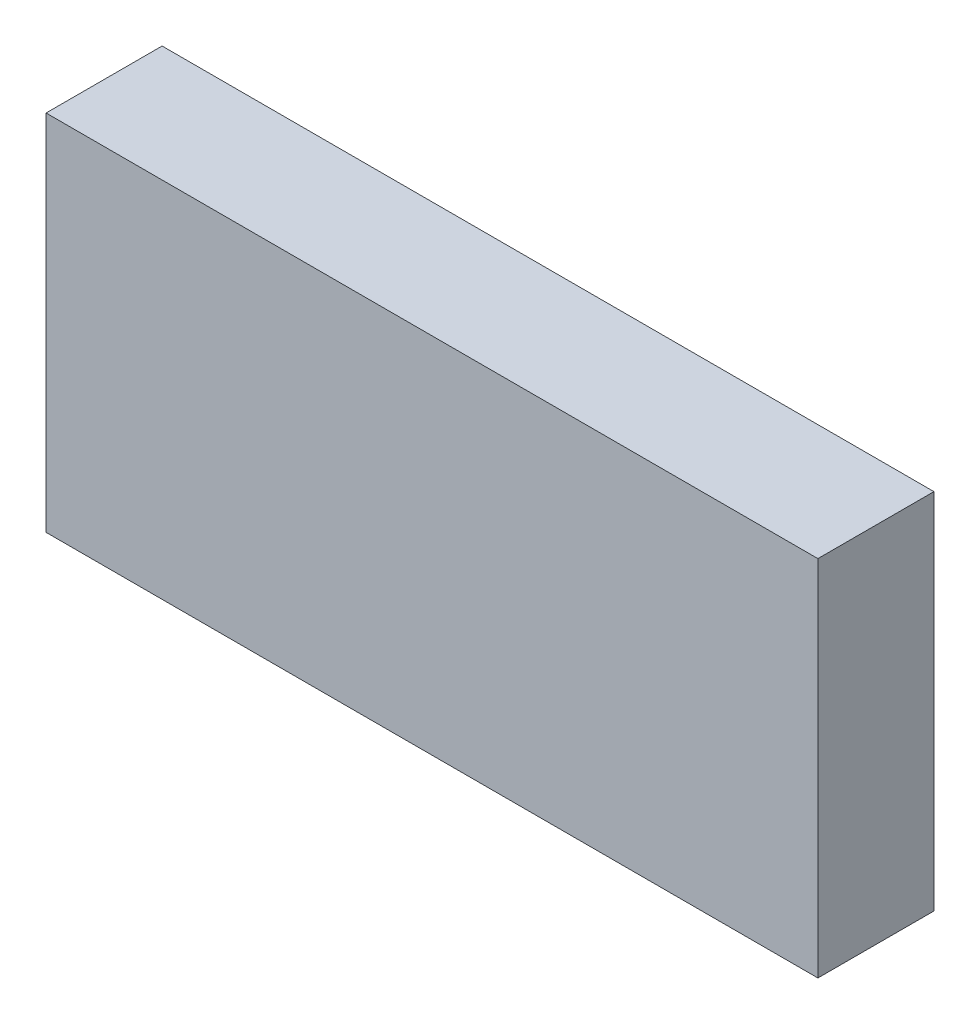
ISO-10303-21;
HEADER;
FILE_DESCRIPTION(('STEP AP214'),'2;1');
FILE_NAME('part.step','',(''),(''),'','','');
FILE_SCHEMA(('AUTOMOTIVE_DESIGN { 1 0 10303 214 1 1 1 1 }'));
ENDSEC;
DATA;
#1=APPLICATION_CONTEXT('core data for automotive mechanical design processes');
#2=APPLICATION_PROTOCOL_DEFINITION('international standard','automotive_design',2000,#1);
#3=PRODUCT_CONTEXT('',#1,'mechanical');
#4=PRODUCT('Part','Part','',(#3));
#5=PRODUCT_RELATED_PRODUCT_CATEGORY('part','',(#4));
#6=PRODUCT_DEFINITION_FORMATION('','',#4);
#7=PRODUCT_DEFINITION_CONTEXT('part definition',#1,'design');
#8=PRODUCT_DEFINITION('design','',#6,#7);
#9=PRODUCT_DEFINITION_SHAPE('','',#8);
#10=(LENGTH_UNIT() NAMED_UNIT(*) SI_UNIT(.MILLI.,.METRE.));
#11=(NAMED_UNIT(*) PLANE_ANGLE_UNIT() SI_UNIT($,.RADIAN.));
#12=(NAMED_UNIT(*) SI_UNIT($,.STERADIAN.) SOLID_ANGLE_UNIT());
#13=UNCERTAINTY_MEASURE_WITH_UNIT(LENGTH_MEASURE(1.E-05),#10,'distance_accuracy_value','');
#14=(GEOMETRIC_REPRESENTATION_CONTEXT(3) GLOBAL_UNCERTAINTY_ASSIGNED_CONTEXT((#13)) GLOBAL_UNIT_ASSIGNED_CONTEXT((#10,
#11,#12)) REPRESENTATION_CONTEXT('',''));
#15=CARTESIAN_POINT('',(0.,0.,0.));
#16=DIRECTION('',(0.,0.,1.));
#17=DIRECTION('',(1.,0.,0.));
#18=AXIS2_PLACEMENT_3D('',#15,#16,#17);
#19=CARTESIAN_POINT('',(-76.5,-36.,0.));
#20=DIRECTION('',(0.,0.,1.));
#21=DIRECTION('',(1.,0.,0.));
#22=AXIS2_PLACEMENT_3D('',#19,#20,#21);
#23=PLANE('',#22);
#24=DIRECTION('',(0.,1.,0.));
#25=VECTOR('',#24,1.);
#26=CARTESIAN_POINT('',(-76.5,-36.,0.));
#27=LINE('',#26,#25);
#28=CARTESIAN_POINT('',(-76.5,-36.,0.));
#29=VERTEX_POINT('',#28);
#30=CARTESIAN_POINT('',(-76.5,36.,0.));
#31=VERTEX_POINT('',#30);
#32=EDGE_CURVE('E78',#29,#31,#27,.T.);
#33=ORIENTED_EDGE('',*,*,#32,.F.);
#34=DIRECTION('',(1.,0.,0.));
#35=VECTOR('',#34,1.);
#36=CARTESIAN_POINT('',(-76.5,-36.,0.));
#37=LINE('',#36,#35);
#38=CARTESIAN_POINT('',(76.5,-36.,0.));
#39=VERTEX_POINT('',#38);
#40=EDGE_CURVE('E61',#29,#39,#37,.T.);
#41=ORIENTED_EDGE('',*,*,#40,.T.);
#42=DIRECTION('',(0.,1.,0.));
#43=VECTOR('',#42,1.);
#44=CARTESIAN_POINT('',(76.5,-36.,0.));
#45=LINE('',#44,#43);
#46=CARTESIAN_POINT('',(76.5,36.,0.));
#47=VERTEX_POINT('',#46);
#48=EDGE_CURVE('E72',#39,#47,#45,.T.);
#49=ORIENTED_EDGE('',*,*,#48,.T.);
#50=DIRECTION('',(1.,0.,0.));
#51=VECTOR('',#50,1.);
#52=CARTESIAN_POINT('',(-76.5,36.,0.));
#53=LINE('',#52,#51);
#54=EDGE_CURVE('E9',#31,#47,#53,.T.);
#55=ORIENTED_EDGE('',*,*,#54,.F.);
#56=EDGE_LOOP('',(#33,#41,#49,#55));
#57=FACE_BOUND('',#56,.T.);
#58=ADVANCED_FACE('F14',(#57),#23,.T.);
#59=CARTESIAN_POINT('',(-76.5,-36.,-23.));
#60=DIRECTION('',(0.,0.,1.));
#61=DIRECTION('',(1.,0.,0.));
#62=AXIS2_PLACEMENT_3D('',#59,#60,#61);
#63=PLANE('',#62);
#64=DIRECTION('',(1.,0.,0.));
#65=VECTOR('',#64,1.);
#66=CARTESIAN_POINT('',(-76.5,36.,-23.));
#67=LINE('',#66,#65);
#68=CARTESIAN_POINT('',(-76.5,36.,-23.));
#69=VERTEX_POINT('',#68);
#70=CARTESIAN_POINT('',(76.5,36.,-23.));
#71=VERTEX_POINT('',#70);
#72=EDGE_CURVE('E25',#69,#71,#67,.T.);
#73=ORIENTED_EDGE('',*,*,#72,.T.);
#74=DIRECTION('',(0.,1.,0.));
#75=VECTOR('',#74,1.);
#76=CARTESIAN_POINT('',(76.5,-36.,-23.));
#77=LINE('',#76,#75);
#78=CARTESIAN_POINT('',(76.5,-36.,-23.));
#79=VERTEX_POINT('',#78);
#80=EDGE_CURVE('E95',#79,#71,#77,.T.);
#81=ORIENTED_EDGE('',*,*,#80,.F.);
#82=DIRECTION('',(1.,0.,0.));
#83=VECTOR('',#82,1.);
#84=CARTESIAN_POINT('',(-76.5,-36.,-23.));
#85=LINE('',#84,#83);
#86=CARTESIAN_POINT('',(-76.5,-36.,-23.));
#87=VERTEX_POINT('',#86);
#88=EDGE_CURVE('E71',#87,#79,#85,.T.);
#89=ORIENTED_EDGE('',*,*,#88,.F.);
#90=DIRECTION('',(0.,1.,0.));
#91=VECTOR('',#90,1.);
#92=CARTESIAN_POINT('',(-76.5,-36.,-23.));
#93=LINE('',#92,#91);
#94=EDGE_CURVE('E80',#87,#69,#93,.T.);
#95=ORIENTED_EDGE('',*,*,#94,.T.);
#96=EDGE_LOOP('',(#73,#81,#89,#95));
#97=FACE_BOUND('',#96,.T.);
#98=ADVANCED_FACE('F110',(#97),#63,.F.);
#99=CARTESIAN_POINT('',(-76.5,36.,-23.));
#100=DIRECTION('',(0.,1.,0.));
#101=DIRECTION('',(1.,0.,0.));
#102=AXIS2_PLACEMENT_3D('',#99,#100,#101);
#103=PLANE('',#102);
#104=ORIENTED_EDGE('',*,*,#72,.F.);
#105=DIRECTION('',(0.,0.,1.));
#106=VECTOR('',#105,1.);
#107=CARTESIAN_POINT('',(-76.5,36.,-23.));
#108=LINE('',#107,#106);
#109=EDGE_CURVE('E18',#69,#31,#108,.T.);
#110=ORIENTED_EDGE('',*,*,#109,.T.);
#111=ORIENTED_EDGE('',*,*,#54,.T.);
#112=DIRECTION('',(0.,0.,1.));
#113=VECTOR('',#112,1.);
#114=CARTESIAN_POINT('',(76.5,36.,-23.));
#115=LINE('',#114,#113);
#116=EDGE_CURVE('E91',#71,#47,#115,.T.);
#117=ORIENTED_EDGE('',*,*,#116,.F.);
#118=EDGE_LOOP('',(#104,#110,#111,#117));
#119=FACE_BOUND('',#118,.T.);
#120=ADVANCED_FACE('F16',(#119),#103,.T.);
#121=CARTESIAN_POINT('',(-76.5,-36.,-23.));
#122=DIRECTION('',(0.,1.,0.));
#123=DIRECTION('',(1.,0.,0.));
#124=AXIS2_PLACEMENT_3D('',#121,#122,#123);
#125=PLANE('',#124);
#126=DIRECTION('',(0.,0.,1.));
#127=VECTOR('',#126,1.);
#128=CARTESIAN_POINT('',(76.5,-36.,-23.));
#129=LINE('',#128,#127);
#130=EDGE_CURVE('E68',#79,#39,#129,.T.);
#131=ORIENTED_EDGE('',*,*,#130,.T.);
#132=ORIENTED_EDGE('',*,*,#40,.F.);
#133=DIRECTION('',(0.,0.,1.));
#134=VECTOR('',#133,1.);
#135=CARTESIAN_POINT('',(-76.5,-36.,-23.));
#136=LINE('',#135,#134);
#137=EDGE_CURVE('E65',#87,#29,#136,.T.);
#138=ORIENTED_EDGE('',*,*,#137,.F.);
#139=ORIENTED_EDGE('',*,*,#88,.T.);
#140=EDGE_LOOP('',(#131,#132,#138,#139));
#141=FACE_BOUND('',#140,.T.);
#142=ADVANCED_FACE('F63',(#141),#125,.F.);
#143=CARTESIAN_POINT('',(76.5,-36.,-23.));
#144=DIRECTION('',(1.,0.,0.));
#145=DIRECTION('',(0.,1.,0.));
#146=AXIS2_PLACEMENT_3D('',#143,#144,#145);
#147=PLANE('',#146);
#148=ORIENTED_EDGE('',*,*,#130,.F.);
#149=ORIENTED_EDGE('',*,*,#80,.T.);
#150=ORIENTED_EDGE('',*,*,#116,.T.);
#151=ORIENTED_EDGE('',*,*,#48,.F.);
#152=EDGE_LOOP('',(#148,#149,#150,#151));
#153=FACE_BOUND('',#152,.T.);
#154=ADVANCED_FACE('F113',(#153),#147,.T.);
#155=CARTESIAN_POINT('',(-76.5,-36.,-23.));
#156=DIRECTION('',(1.,0.,0.));
#157=DIRECTION('',(0.,1.,0.));
#158=AXIS2_PLACEMENT_3D('',#155,#156,#157);
#159=PLANE('',#158);
#160=ORIENTED_EDGE('',*,*,#32,.T.);
#161=ORIENTED_EDGE('',*,*,#109,.F.);
#162=ORIENTED_EDGE('',*,*,#94,.F.);
#163=ORIENTED_EDGE('',*,*,#137,.T.);
#164=EDGE_LOOP('',(#160,#161,#162,#163));
#165=FACE_BOUND('',#164,.T.);
#166=ADVANCED_FACE('F76',(#165),#159,.F.);
#167=CLOSED_SHELL('',(#58,#98,#120,#142,#154,#166));
#168=MANIFOLD_SOLID_BREP('B1',#167);
#169=ADVANCED_BREP_SHAPE_REPRESENTATION('',(#18,#168),#14);
#170=SHAPE_DEFINITION_REPRESENTATION(#9,#169);
ENDSEC;
END-ISO-10303-21;
